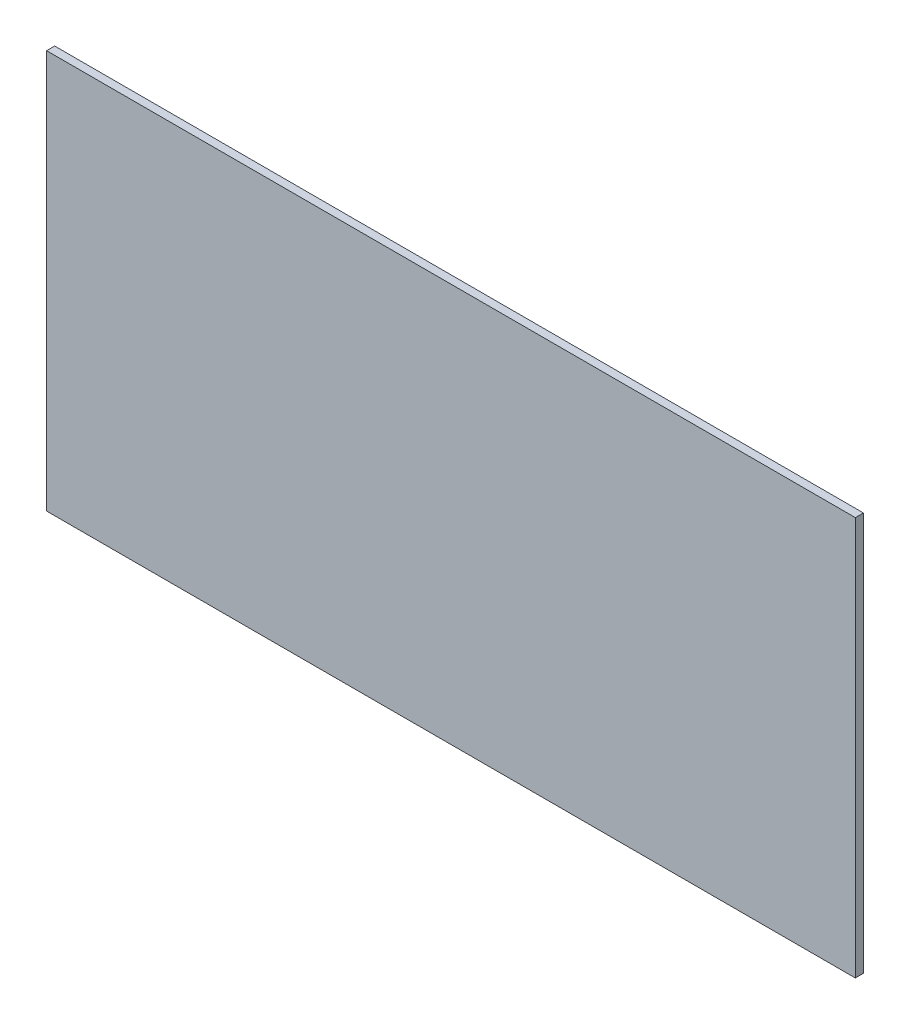
ISO-10303-21;
HEADER;
FILE_DESCRIPTION(('STEP AP214'),'2;1');
FILE_NAME('part.step','',(''),(''),'','','');
FILE_SCHEMA(('AUTOMOTIVE_DESIGN { 1 0 10303 214 1 1 1 1 }'));
ENDSEC;
DATA;
#1=APPLICATION_CONTEXT('core data for automotive mechanical design processes');
#2=APPLICATION_PROTOCOL_DEFINITION('international standard','automotive_design',2000,#1);
#3=PRODUCT_CONTEXT('',#1,'mechanical');
#4=PRODUCT('Part','Part','',(#3));
#5=PRODUCT_RELATED_PRODUCT_CATEGORY('part','',(#4));
#6=PRODUCT_DEFINITION_FORMATION('','',#4);
#7=PRODUCT_DEFINITION_CONTEXT('part definition',#1,'design');
#8=PRODUCT_DEFINITION('design','',#6,#7);
#9=PRODUCT_DEFINITION_SHAPE('','',#8);
#10=(LENGTH_UNIT() NAMED_UNIT(*) SI_UNIT(.MILLI.,.METRE.));
#11=(NAMED_UNIT(*) PLANE_ANGLE_UNIT() SI_UNIT($,.RADIAN.));
#12=(NAMED_UNIT(*) SI_UNIT($,.STERADIAN.) SOLID_ANGLE_UNIT());
#13=UNCERTAINTY_MEASURE_WITH_UNIT(LENGTH_MEASURE(1.E-05),#10,'distance_accuracy_value','');
#14=(GEOMETRIC_REPRESENTATION_CONTEXT(3) GLOBAL_UNCERTAINTY_ASSIGNED_CONTEXT((#13)) GLOBAL_UNIT_ASSIGNED_CONTEXT((#10,
#11,#12)) REPRESENTATION_CONTEXT('',''));
#15=CARTESIAN_POINT('',(0.,0.,0.));
#16=DIRECTION('',(0.,0.,1.));
#17=DIRECTION('',(1.,0.,0.));
#18=AXIS2_PLACEMENT_3D('',#15,#16,#17);
#19=CARTESIAN_POINT('',(0.,78.275,3.175));
#20=DIRECTION('',(0.,1.,0.));
#21=DIRECTION('',(0.,0.,1.));
#22=AXIS2_PLACEMENT_3D('',#19,#20,#21);
#23=PLANE('',#22);
#24=DIRECTION('',(1.,0.,0.));
#25=VECTOR('',#24,1.);
#26=CARTESIAN_POINT('',(0.,78.275,0.));
#27=LINE('',#26,#25);
#28=CARTESIAN_POINT('',(-158.775,78.275,0.));
#29=VERTEX_POINT('',#28);
#30=CARTESIAN_POINT('',(158.775,78.275,0.));
#31=VERTEX_POINT('',#30);
#32=EDGE_CURVE('E102',#29,#31,#27,.T.);
#33=ORIENTED_EDGE('',*,*,#32,.F.);
#34=DIRECTION('',(0.,0.,-1.));
#35=VECTOR('',#34,1.);
#36=CARTESIAN_POINT('',(-158.775,78.275,3.175));
#37=LINE('',#36,#35);
#38=CARTESIAN_POINT('',(-158.775,78.275,3.175));
#39=VERTEX_POINT('',#38);
#40=EDGE_CURVE('E11',#39,#29,#37,.T.);
#41=ORIENTED_EDGE('',*,*,#40,.F.);
#42=DIRECTION('',(1.,0.,0.));
#43=VECTOR('',#42,1.);
#44=CARTESIAN_POINT('',(0.,78.275,3.175));
#45=LINE('',#44,#43);
#46=CARTESIAN_POINT('',(158.775,78.275,3.175));
#47=VERTEX_POINT('',#46);
#48=EDGE_CURVE('E87',#39,#47,#45,.T.);
#49=ORIENTED_EDGE('',*,*,#48,.T.);
#50=DIRECTION('',(0.,0.,-1.));
#51=VECTOR('',#50,1.);
#52=CARTESIAN_POINT('',(158.775,78.275,3.175));
#53=LINE('',#52,#51);
#54=EDGE_CURVE('E55',#47,#31,#53,.T.);
#55=ORIENTED_EDGE('',*,*,#54,.T.);
#56=EDGE_LOOP('',(#33,#41,#49,#55));
#57=FACE_BOUND('',#56,.T.);
#58=ADVANCED_FACE('F39',(#57),#23,.T.);
#59=CARTESIAN_POINT('',(-158.775,0.,3.175));
#60=DIRECTION('',(1.,0.,0.));
#61=DIRECTION('',(0.,0.,-1.));
#62=AXIS2_PLACEMENT_3D('',#59,#60,#61);
#63=PLANE('',#62);
#64=DIRECTION('',(0.,-1.,0.));
#65=VECTOR('',#64,1.);
#66=CARTESIAN_POINT('',(-158.775,0.,0.));
#67=LINE('',#66,#65);
#68=CARTESIAN_POINT('',(-158.775,-78.275,0.));
#69=VERTEX_POINT('',#68);
#70=EDGE_CURVE('E93',#29,#69,#67,.T.);
#71=ORIENTED_EDGE('',*,*,#70,.T.);
#72=DIRECTION('',(0.,0.,-1.));
#73=VECTOR('',#72,1.);
#74=CARTESIAN_POINT('',(-158.775,-78.275,3.175));
#75=LINE('',#74,#73);
#76=CARTESIAN_POINT('',(-158.775,-78.275,3.175));
#77=VERTEX_POINT('',#76);
#78=EDGE_CURVE('E47',#77,#69,#75,.T.);
#79=ORIENTED_EDGE('',*,*,#78,.F.);
#80=DIRECTION('',(0.,-1.,0.));
#81=VECTOR('',#80,1.);
#82=CARTESIAN_POINT('',(-158.775,0.,3.175));
#83=LINE('',#82,#81);
#84=EDGE_CURVE('E81',#39,#77,#83,.T.);
#85=ORIENTED_EDGE('',*,*,#84,.F.);
#86=ORIENTED_EDGE('',*,*,#40,.T.);
#87=EDGE_LOOP('',(#71,#79,#85,#86));
#88=FACE_BOUND('',#87,.T.);
#89=ADVANCED_FACE('F91',(#88),#63,.F.);
#90=CARTESIAN_POINT('',(0.,-78.275,3.175));
#91=DIRECTION('',(0.,1.,0.));
#92=DIRECTION('',(-1.,0.,0.));
#93=AXIS2_PLACEMENT_3D('',#90,#91,#92);
#94=PLANE('',#93);
#95=DIRECTION('',(1.,0.,0.));
#96=VECTOR('',#95,1.);
#97=CARTESIAN_POINT('',(0.,-78.275,0.));
#98=LINE('',#97,#96);
#99=CARTESIAN_POINT('',(158.775,-78.275,0.));
#100=VERTEX_POINT('',#99);
#101=EDGE_CURVE('E105',#69,#100,#98,.T.);
#102=ORIENTED_EDGE('',*,*,#101,.T.);
#103=DIRECTION('',(0.,0.,-1.));
#104=VECTOR('',#103,1.);
#105=CARTESIAN_POINT('',(158.775,-78.275,3.175));
#106=LINE('',#105,#104);
#107=CARTESIAN_POINT('',(158.775,-78.275,3.175));
#108=VERTEX_POINT('',#107);
#109=EDGE_CURVE('E69',#108,#100,#106,.T.);
#110=ORIENTED_EDGE('',*,*,#109,.F.);
#111=DIRECTION('',(1.,0.,0.));
#112=VECTOR('',#111,1.);
#113=CARTESIAN_POINT('',(0.,-78.275,3.175));
#114=LINE('',#113,#112);
#115=EDGE_CURVE('E86',#77,#108,#114,.T.);
#116=ORIENTED_EDGE('',*,*,#115,.F.);
#117=ORIENTED_EDGE('',*,*,#78,.T.);
#118=EDGE_LOOP('',(#102,#110,#116,#117));
#119=FACE_BOUND('',#118,.T.);
#120=ADVANCED_FACE('F96',(#119),#94,.F.);
#121=CARTESIAN_POINT('',(158.775,0.,3.175));
#122=DIRECTION('',(1.,0.,0.));
#123=DIRECTION('',(0.,0.,-1.));
#124=AXIS2_PLACEMENT_3D('',#121,#122,#123);
#125=PLANE('',#124);
#126=DIRECTION('',(0.,-1.,0.));
#127=VECTOR('',#126,1.);
#128=CARTESIAN_POINT('',(158.775,0.,0.));
#129=LINE('',#128,#127);
#130=EDGE_CURVE('E107',#31,#100,#129,.T.);
#131=ORIENTED_EDGE('',*,*,#130,.F.);
#132=ORIENTED_EDGE('',*,*,#54,.F.);
#133=DIRECTION('',(0.,-1.,0.));
#134=VECTOR('',#133,1.);
#135=CARTESIAN_POINT('',(158.775,0.,3.175));
#136=LINE('',#135,#134);
#137=EDGE_CURVE('E97',#47,#108,#136,.T.);
#138=ORIENTED_EDGE('',*,*,#137,.T.);
#139=ORIENTED_EDGE('',*,*,#109,.T.);
#140=EDGE_LOOP('',(#131,#132,#138,#139));
#141=FACE_BOUND('',#140,.T.);
#142=ADVANCED_FACE('F112',(#141),#125,.T.);
#143=CARTESIAN_POINT('',(0.,0.,3.175));
#144=DIRECTION('',(0.,0.,1.));
#145=DIRECTION('',(1.,0.,0.));
#146=AXIS2_PLACEMENT_3D('',#143,#144,#145);
#147=PLANE('',#146);
#148=ORIENTED_EDGE('',*,*,#48,.F.);
#149=ORIENTED_EDGE('',*,*,#84,.T.);
#150=ORIENTED_EDGE('',*,*,#115,.T.);
#151=ORIENTED_EDGE('',*,*,#137,.F.);
#152=EDGE_LOOP('',(#148,#149,#150,#151));
#153=FACE_BOUND('',#152,.T.);
#154=ADVANCED_FACE('F83',(#153),#147,.T.);
#155=CARTESIAN_POINT('',(0.,0.,0.));
#156=DIRECTION('',(0.,0.,1.));
#157=DIRECTION('',(1.,0.,0.));
#158=AXIS2_PLACEMENT_3D('',#155,#156,#157);
#159=PLANE('',#158);
#160=ORIENTED_EDGE('',*,*,#32,.T.);
#161=ORIENTED_EDGE('',*,*,#130,.T.);
#162=ORIENTED_EDGE('',*,*,#101,.F.);
#163=ORIENTED_EDGE('',*,*,#70,.F.);
#164=EDGE_LOOP('',(#160,#161,#162,#163));
#165=FACE_BOUND('',#164,.T.);
#166=ADVANCED_FACE('F119',(#165),#159,.F.);
#167=CLOSED_SHELL('',(#58,#89,#120,#142,#154,#166));
#168=MANIFOLD_SOLID_BREP('B2',#167);
#169=ADVANCED_BREP_SHAPE_REPRESENTATION('',(#18,#168),#14);
#170=SHAPE_DEFINITION_REPRESENTATION(#9,#169);
ENDSEC;
END-ISO-10303-21;
